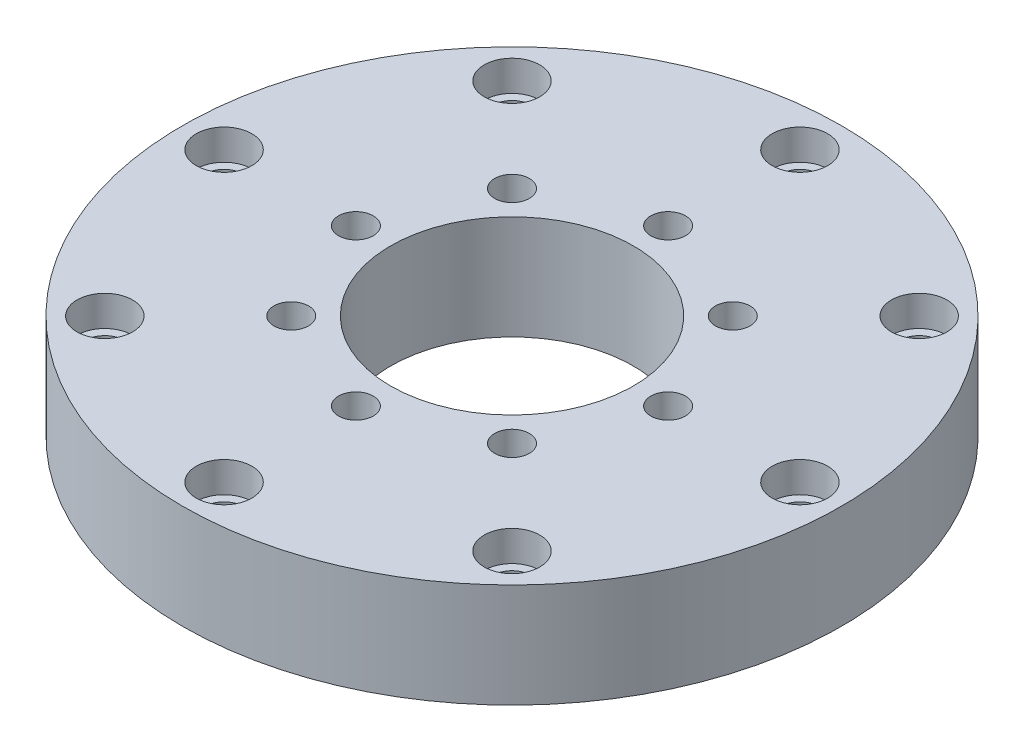
ISO-10303-21;
HEADER;
FILE_DESCRIPTION(('STEP AP214'),'2;1');
FILE_NAME('part.step','',(''),(''),'','','');
FILE_SCHEMA(('AUTOMOTIVE_DESIGN { 1 0 10303 214 1 1 1 1 }'));
ENDSEC;
DATA;
#1=APPLICATION_CONTEXT('core data for automotive mechanical design processes');
#2=APPLICATION_PROTOCOL_DEFINITION('international standard','automotive_design',2000,#1);
#3=PRODUCT_CONTEXT('',#1,'mechanical');
#4=PRODUCT('Part','Part','',(#3));
#5=PRODUCT_RELATED_PRODUCT_CATEGORY('part','',(#4));
#6=PRODUCT_DEFINITION_FORMATION('','',#4);
#7=PRODUCT_DEFINITION_CONTEXT('part definition',#1,'design');
#8=PRODUCT_DEFINITION('design','',#6,#7);
#9=PRODUCT_DEFINITION_SHAPE('','',#8);
#10=(LENGTH_UNIT() NAMED_UNIT(*) SI_UNIT(.MILLI.,.METRE.));
#11=(NAMED_UNIT(*) PLANE_ANGLE_UNIT() SI_UNIT($,.RADIAN.));
#12=(NAMED_UNIT(*) SI_UNIT($,.STERADIAN.) SOLID_ANGLE_UNIT());
#13=UNCERTAINTY_MEASURE_WITH_UNIT(LENGTH_MEASURE(1.E-05),#10,'distance_accuracy_value','');
#14=(GEOMETRIC_REPRESENTATION_CONTEXT(3) GLOBAL_UNCERTAINTY_ASSIGNED_CONTEXT((#13)) GLOBAL_UNIT_ASSIGNED_CONTEXT((#10,
#11,#12)) REPRESENTATION_CONTEXT('',''));
#15=CARTESIAN_POINT('',(0.,0.,0.));
#16=DIRECTION('',(0.,0.,1.));
#17=DIRECTION('',(1.,0.,0.));
#18=AXIS2_PLACEMENT_3D('',#15,#16,#17);
#19=CARTESIAN_POINT('',(0.,15.,0.));
#20=DIRECTION('',(0.,1.,0.));
#21=DIRECTION('',(0.,0.,1.));
#22=AXIS2_PLACEMENT_3D('',#19,#20,#21);
#23=PLANE('',#22);
#24=CARTESIAN_POINT('',(0.,15.,-41.5));
#25=DIRECTION('',(0.,1.,0.));
#26=DIRECTION('',(0.,0.,1.));
#27=AXIS2_PLACEMENT_3D('',#24,#25,#26);
#28=CIRCLE('',#27,4.);
#29=CARTESIAN_POINT('',(0.,15.,-37.5));
#30=VERTEX_POINT('',#29);
#31=EDGE_CURVE('E274',#30,#30,#28,.T.);
#32=ORIENTED_EDGE('',*,*,#31,.F.);
#33=EDGE_LOOP('',(#32));
#34=FACE_BOUND('',#33,.T.);
#35=CARTESIAN_POINT('',(29.3449314192417,15.,-29.3449314192417));
#36=DIRECTION('',(0.,1.,0.));
#37=DIRECTION('',(0.,0.,1.));
#38=AXIS2_PLACEMENT_3D('',#35,#36,#37);
#39=CIRCLE('',#38,4.);
#40=CARTESIAN_POINT('',(29.3449314192417,15.,-25.3449314192417));
#41=VERTEX_POINT('',#40);
#42=EDGE_CURVE('E105',#41,#41,#39,.T.);
#43=ORIENTED_EDGE('',*,*,#42,.F.);
#44=EDGE_LOOP('',(#43));
#45=FACE_BOUND('',#44,.T.);
#46=CARTESIAN_POINT('',(41.5,15.,0.));
#47=DIRECTION('',(0.,1.,0.));
#48=DIRECTION('',(0.,0.,1.));
#49=AXIS2_PLACEMENT_3D('',#46,#47,#48);
#50=CIRCLE('',#49,4.);
#51=CARTESIAN_POINT('',(41.5,15.,4.));
#52=VERTEX_POINT('',#51);
#53=EDGE_CURVE('E96',#52,#52,#50,.T.);
#54=ORIENTED_EDGE('',*,*,#53,.F.);
#55=EDGE_LOOP('',(#54));
#56=FACE_BOUND('',#55,.T.);
#57=CARTESIAN_POINT('',(29.3449314192417,15.,29.3449314192417));
#58=DIRECTION('',(0.,1.,0.));
#59=DIRECTION('',(0.,0.,1.));
#60=AXIS2_PLACEMENT_3D('',#57,#58,#59);
#61=CIRCLE('',#60,4.);
#62=CARTESIAN_POINT('',(29.3449314192417,15.,33.3449314192417));
#63=VERTEX_POINT('',#62);
#64=EDGE_CURVE('E91',#63,#63,#61,.T.);
#65=ORIENTED_EDGE('',*,*,#64,.F.);
#66=EDGE_LOOP('',(#65));
#67=FACE_BOUND('',#66,.T.);
#68=CARTESIAN_POINT('',(0.,15.,41.5));
#69=DIRECTION('',(0.,1.,0.));
#70=DIRECTION('',(0.,0.,1.));
#71=AXIS2_PLACEMENT_3D('',#68,#69,#70);
#72=CIRCLE('',#71,4.);
#73=CARTESIAN_POINT('',(0.,15.,45.5));
#74=VERTEX_POINT('',#73);
#75=EDGE_CURVE('E86',#74,#74,#72,.T.);
#76=ORIENTED_EDGE('',*,*,#75,.F.);
#77=EDGE_LOOP('',(#76));
#78=FACE_BOUND('',#77,.T.);
#79=CARTESIAN_POINT('',(-29.3449314192417,15.,29.3449314192417));
#80=DIRECTION('',(0.,1.,0.));
#81=DIRECTION('',(0.,0.,1.));
#82=AXIS2_PLACEMENT_3D('',#79,#80,#81);
#83=CIRCLE('',#82,4.);
#84=CARTESIAN_POINT('',(-29.3449314192417,15.,33.3449314192417));
#85=VERTEX_POINT('',#84);
#86=EDGE_CURVE('E80',#85,#85,#83,.T.);
#87=ORIENTED_EDGE('',*,*,#86,.F.);
#88=EDGE_LOOP('',(#87));
#89=FACE_BOUND('',#88,.T.);
#90=CARTESIAN_POINT('',(-41.5,15.,0.));
#91=DIRECTION('',(0.,1.,0.));
#92=DIRECTION('',(0.,0.,1.));
#93=AXIS2_PLACEMENT_3D('',#90,#91,#92);
#94=CIRCLE('',#93,4.);
#95=CARTESIAN_POINT('',(-41.5,15.,4.00000000000001));
#96=VERTEX_POINT('',#95);
#97=EDGE_CURVE('E74',#96,#96,#94,.T.);
#98=ORIENTED_EDGE('',*,*,#97,.F.);
#99=EDGE_LOOP('',(#98));
#100=FACE_BOUND('',#99,.T.);
#101=CARTESIAN_POINT('',(-29.3449314192417,15.,-29.3449314192417));
#102=DIRECTION('',(0.,1.,0.));
#103=DIRECTION('',(0.,0.,1.));
#104=AXIS2_PLACEMENT_3D('',#101,#102,#103);
#105=CIRCLE('',#104,4.);
#106=CARTESIAN_POINT('',(-29.3449314192417,15.,-25.3449314192417));
#107=VERTEX_POINT('',#106);
#108=EDGE_CURVE('E68',#107,#107,#105,.T.);
#109=ORIENTED_EDGE('',*,*,#108,.F.);
#110=EDGE_LOOP('',(#109));
#111=FACE_BOUND('',#110,.T.);
#112=CARTESIAN_POINT('',(-22.5,15.,0.));
#113=DIRECTION('',(0.,1.,0.));
#114=DIRECTION('',(0.,0.,1.));
#115=AXIS2_PLACEMENT_3D('',#112,#113,#114);
#116=CIRCLE('',#115,2.5);
#117=CARTESIAN_POINT('',(-22.5,15.,2.50000000000001));
#118=VERTEX_POINT('',#117);
#119=EDGE_CURVE('E155',#118,#118,#116,.T.);
#120=ORIENTED_EDGE('',*,*,#119,.F.);
#121=EDGE_LOOP('',(#120));
#122=FACE_BOUND('',#121,.T.);
#123=CARTESIAN_POINT('',(0.,15.,22.5));
#124=DIRECTION('',(0.,1.,0.));
#125=DIRECTION('',(0.,0.,1.));
#126=AXIS2_PLACEMENT_3D('',#123,#124,#125);
#127=CIRCLE('',#126,2.5);
#128=CARTESIAN_POINT('',(0.,15.,25.));
#129=VERTEX_POINT('',#128);
#130=EDGE_CURVE('E171',#129,#129,#127,.T.);
#131=ORIENTED_EDGE('',*,*,#130,.F.);
#132=EDGE_LOOP('',(#131));
#133=FACE_BOUND('',#132,.T.);
#134=CARTESIAN_POINT('',(22.5,15.,0.));
#135=DIRECTION('',(0.,1.,0.));
#136=DIRECTION('',(0.,0.,1.));
#137=AXIS2_PLACEMENT_3D('',#134,#135,#136);
#138=CIRCLE('',#137,2.5);
#139=CARTESIAN_POINT('',(22.5,15.,2.5));
#140=VERTEX_POINT('',#139);
#141=EDGE_CURVE('E187',#140,#140,#138,.T.);
#142=ORIENTED_EDGE('',*,*,#141,.F.);
#143=EDGE_LOOP('',(#142));
#144=FACE_BOUND('',#143,.T.);
#145=CARTESIAN_POINT('',(0.,15.,0.));
#146=DIRECTION('',(0.,1.,0.));
#147=DIRECTION('',(0.,0.,1.));
#148=AXIS2_PLACEMENT_3D('',#145,#146,#147);
#149=CIRCLE('',#148,47.5);
#150=CARTESIAN_POINT('',(0.,15.,47.5));
#151=VERTEX_POINT('',#150);
#152=EDGE_CURVE('E10',#151,#151,#149,.T.);
#153=ORIENTED_EDGE('',*,*,#152,.T.);
#154=EDGE_LOOP('',(#153));
#155=FACE_BOUND('',#154,.T.);
#156=CARTESIAN_POINT('',(0.,15.,0.));
#157=DIRECTION('',(0.,1.,0.));
#158=DIRECTION('',(0.,0.,1.));
#159=AXIS2_PLACEMENT_3D('',#156,#157,#158);
#160=CIRCLE('',#159,17.5);
#161=CARTESIAN_POINT('',(0.,15.,17.5));
#162=VERTEX_POINT('',#161);
#163=EDGE_CURVE('E52',#162,#162,#160,.T.);
#164=ORIENTED_EDGE('',*,*,#163,.F.);
#165=EDGE_LOOP('',(#164));
#166=FACE_BOUND('',#165,.T.);
#167=CARTESIAN_POINT('',(0.,15.,-22.5));
#168=DIRECTION('',(0.,1.,0.));
#169=DIRECTION('',(0.,0.,1.));
#170=AXIS2_PLACEMENT_3D('',#167,#168,#169);
#171=CIRCLE('',#170,2.5);
#172=CARTESIAN_POINT('',(0.,15.,-20.));
#173=VERTEX_POINT('',#172);
#174=EDGE_CURVE('E231',#173,#173,#171,.T.);
#175=ORIENTED_EDGE('',*,*,#174,.F.);
#176=EDGE_LOOP('',(#175));
#177=FACE_BOUND('',#176,.T.);
#178=CARTESIAN_POINT('',(15.9099025766973,15.,-15.9099025766973));
#179=DIRECTION('',(0.,1.,0.));
#180=DIRECTION('',(0.,0.,1.));
#181=AXIS2_PLACEMENT_3D('',#178,#179,#180);
#182=CIRCLE('',#181,2.5);
#183=CARTESIAN_POINT('',(15.9099025766973,15.,-13.4099025766973));
#184=VERTEX_POINT('',#183);
#185=EDGE_CURVE('E195',#184,#184,#182,.T.);
#186=ORIENTED_EDGE('',*,*,#185,.F.);
#187=EDGE_LOOP('',(#186));
#188=FACE_BOUND('',#187,.T.);
#189=CARTESIAN_POINT('',(15.9099025766973,15.,15.9099025766973));
#190=DIRECTION('',(0.,1.,0.));
#191=DIRECTION('',(0.,0.,1.));
#192=AXIS2_PLACEMENT_3D('',#189,#190,#191);
#193=CIRCLE('',#192,2.50000000000001);
#194=CARTESIAN_POINT('',(15.9099025766973,15.,18.4099025766973));
#195=VERTEX_POINT('',#194);
#196=EDGE_CURVE('E179',#195,#195,#193,.T.);
#197=ORIENTED_EDGE('',*,*,#196,.F.);
#198=EDGE_LOOP('',(#197));
#199=FACE_BOUND('',#198,.T.);
#200=CARTESIAN_POINT('',(-15.9099025766973,15.,15.9099025766973));
#201=DIRECTION('',(0.,1.,0.));
#202=DIRECTION('',(0.,0.,1.));
#203=AXIS2_PLACEMENT_3D('',#200,#201,#202);
#204=CIRCLE('',#203,2.5);
#205=CARTESIAN_POINT('',(-15.9099025766973,15.,18.4099025766973));
#206=VERTEX_POINT('',#205);
#207=EDGE_CURVE('E163',#206,#206,#204,.T.);
#208=ORIENTED_EDGE('',*,*,#207,.F.);
#209=EDGE_LOOP('',(#208));
#210=FACE_BOUND('',#209,.T.);
#211=CARTESIAN_POINT('',(-15.9099025766973,15.,-15.9099025766973));
#212=DIRECTION('',(0.,1.,0.));
#213=DIRECTION('',(0.,0.,1.));
#214=AXIS2_PLACEMENT_3D('',#211,#212,#213);
#215=CIRCLE('',#214,2.5);
#216=CARTESIAN_POINT('',(-15.9099025766973,15.,-13.4099025766973));
#217=VERTEX_POINT('',#216);
#218=EDGE_CURVE('E147',#217,#217,#215,.T.);
#219=ORIENTED_EDGE('',*,*,#218,.F.);
#220=EDGE_LOOP('',(#219));
#221=FACE_BOUND('',#220,.T.);
#222=ADVANCED_FACE('F37',(#34,#45,#56,#67,#78,#89,#100,#111,#122,#133,#144,#155,#166,#177,#188,
#199,#210,#221),#23,.T.);
#223=CARTESIAN_POINT('',(0.,0.,0.));
#224=DIRECTION('',(0.,1.,0.));
#225=DIRECTION('',(0.,0.,1.));
#226=AXIS2_PLACEMENT_3D('',#223,#224,#225);
#227=PLANE('',#226);
#228=CARTESIAN_POINT('',(0.,0.,0.));
#229=DIRECTION('',(0.,1.,0.));
#230=DIRECTION('',(0.,0.,1.));
#231=AXIS2_PLACEMENT_3D('',#228,#229,#230);
#232=CIRCLE('',#231,47.5);
#233=CARTESIAN_POINT('',(0.,0.,47.5));
#234=VERTEX_POINT('',#233);
#235=EDGE_CURVE('E46',#234,#234,#232,.T.);
#236=ORIENTED_EDGE('',*,*,#235,.F.);
#237=EDGE_LOOP('',(#236));
#238=FACE_BOUND('',#237,.T.);
#239=CARTESIAN_POINT('',(0.,0.,0.));
#240=DIRECTION('',(0.,1.,0.));
#241=DIRECTION('',(0.,0.,1.));
#242=AXIS2_PLACEMENT_3D('',#239,#240,#241);
#243=CIRCLE('',#242,17.5);
#244=CARTESIAN_POINT('',(0.,0.,17.5));
#245=VERTEX_POINT('',#244);
#246=EDGE_CURVE('E55',#245,#245,#243,.T.);
#247=ORIENTED_EDGE('',*,*,#246,.T.);
#248=EDGE_LOOP('',(#247));
#249=FACE_BOUND('',#248,.T.);
#250=CARTESIAN_POINT('',(0.,0.,-41.5));
#251=DIRECTION('',(0.,1.,0.));
#252=DIRECTION('',(0.,0.,1.));
#253=AXIS2_PLACEMENT_3D('',#250,#251,#252);
#254=CIRCLE('',#253,2.75);
#255=CARTESIAN_POINT('',(0.,0.,-38.75));
#256=VERTEX_POINT('',#255);
#257=EDGE_CURVE('E235',#256,#256,#254,.T.);
#258=ORIENTED_EDGE('',*,*,#257,.T.);
#259=EDGE_LOOP('',(#258));
#260=FACE_BOUND('',#259,.T.);
#261=CARTESIAN_POINT('',(0.,0.,-22.5));
#262=DIRECTION('',(0.,1.,0.));
#263=DIRECTION('',(0.,0.,1.));
#264=AXIS2_PLACEMENT_3D('',#261,#262,#263);
#265=CIRCLE('',#264,2.5);
#266=CARTESIAN_POINT('',(0.,0.,-20.));
#267=VERTEX_POINT('',#266);
#268=EDGE_CURVE('E230',#267,#267,#265,.T.);
#269=ORIENTED_EDGE('',*,*,#268,.T.);
#270=EDGE_LOOP('',(#269));
#271=FACE_BOUND('',#270,.T.);
#272=CARTESIAN_POINT('',(29.3449314192417,0.,-29.3449314192417));
#273=DIRECTION('',(0.,1.,0.));
#274=DIRECTION('',(0.,0.,1.));
#275=AXIS2_PLACEMENT_3D('',#272,#273,#274);
#276=CIRCLE('',#275,2.74999999999999);
#277=CARTESIAN_POINT('',(29.3449314192417,0.,-26.5949314192417));
#278=VERTEX_POINT('',#277);
#279=EDGE_CURVE('E226',#278,#278,#276,.T.);
#280=ORIENTED_EDGE('',*,*,#279,.T.);
#281=EDGE_LOOP('',(#280));
#282=FACE_BOUND('',#281,.T.);
#283=CARTESIAN_POINT('',(41.5,0.,0.));
#284=DIRECTION('',(0.,1.,0.));
#285=DIRECTION('',(0.,0.,1.));
#286=AXIS2_PLACEMENT_3D('',#283,#284,#285);
#287=CIRCLE('',#286,2.75);
#288=CARTESIAN_POINT('',(41.5,0.,2.75));
#289=VERTEX_POINT('',#288);
#290=EDGE_CURVE('E222',#289,#289,#287,.T.);
#291=ORIENTED_EDGE('',*,*,#290,.T.);
#292=EDGE_LOOP('',(#291));
#293=FACE_BOUND('',#292,.T.);
#294=CARTESIAN_POINT('',(29.3449314192417,0.,29.3449314192417));
#295=DIRECTION('',(0.,1.,0.));
#296=DIRECTION('',(0.,0.,1.));
#297=AXIS2_PLACEMENT_3D('',#294,#295,#296);
#298=CIRCLE('',#297,2.74999999999999);
#299=CARTESIAN_POINT('',(29.3449314192417,0.,32.0949314192417));
#300=VERTEX_POINT('',#299);
#301=EDGE_CURVE('E218',#300,#300,#298,.T.);
#302=ORIENTED_EDGE('',*,*,#301,.T.);
#303=EDGE_LOOP('',(#302));
#304=FACE_BOUND('',#303,.T.);
#305=CARTESIAN_POINT('',(0.,0.,41.5));
#306=DIRECTION('',(0.,1.,0.));
#307=DIRECTION('',(0.,0.,1.));
#308=AXIS2_PLACEMENT_3D('',#305,#306,#307);
#309=CIRCLE('',#308,2.75);
#310=CARTESIAN_POINT('',(0.,0.,44.25));
#311=VERTEX_POINT('',#310);
#312=EDGE_CURVE('E214',#311,#311,#309,.T.);
#313=ORIENTED_EDGE('',*,*,#312,.T.);
#314=EDGE_LOOP('',(#313));
#315=FACE_BOUND('',#314,.T.);
#316=CARTESIAN_POINT('',(-29.3449314192417,0.,29.3449314192417));
#317=DIRECTION('',(0.,1.,0.));
#318=DIRECTION('',(0.,0.,1.));
#319=AXIS2_PLACEMENT_3D('',#316,#317,#318);
#320=CIRCLE('',#319,2.75000000000001);
#321=CARTESIAN_POINT('',(-29.3449314192417,0.,32.0949314192417));
#322=VERTEX_POINT('',#321);
#323=EDGE_CURVE('E210',#322,#322,#320,.T.);
#324=ORIENTED_EDGE('',*,*,#323,.T.);
#325=EDGE_LOOP('',(#324));
#326=FACE_BOUND('',#325,.T.);
#327=CARTESIAN_POINT('',(-41.5,0.,0.));
#328=DIRECTION('',(0.,1.,0.));
#329=DIRECTION('',(0.,0.,1.));
#330=AXIS2_PLACEMENT_3D('',#327,#328,#329);
#331=CIRCLE('',#330,2.75000000000001);
#332=CARTESIAN_POINT('',(-41.5,0.,2.75000000000002));
#333=VERTEX_POINT('',#332);
#334=EDGE_CURVE('E206',#333,#333,#331,.T.);
#335=ORIENTED_EDGE('',*,*,#334,.T.);
#336=EDGE_LOOP('',(#335));
#337=FACE_BOUND('',#336,.T.);
#338=CARTESIAN_POINT('',(-29.3449314192417,0.,-29.3449314192417));
#339=DIRECTION('',(0.,1.,0.));
#340=DIRECTION('',(0.,0.,1.));
#341=AXIS2_PLACEMENT_3D('',#338,#339,#340);
#342=CIRCLE('',#341,2.75000000000001);
#343=CARTESIAN_POINT('',(-29.3449314192417,0.,-26.5949314192417));
#344=VERTEX_POINT('',#343);
#345=EDGE_CURVE('E199',#344,#344,#342,.T.);
#346=ORIENTED_EDGE('',*,*,#345,.T.);
#347=EDGE_LOOP('',(#346));
#348=FACE_BOUND('',#347,.T.);
#349=CARTESIAN_POINT('',(15.9099025766973,0.,-15.9099025766973));
#350=DIRECTION('',(0.,1.,0.));
#351=DIRECTION('',(0.,0.,1.));
#352=AXIS2_PLACEMENT_3D('',#349,#350,#351);
#353=CIRCLE('',#352,2.5);
#354=CARTESIAN_POINT('',(15.9099025766973,0.,-13.4099025766973));
#355=VERTEX_POINT('',#354);
#356=EDGE_CURVE('E191',#355,#355,#353,.T.);
#357=ORIENTED_EDGE('',*,*,#356,.T.);
#358=EDGE_LOOP('',(#357));
#359=FACE_BOUND('',#358,.T.);
#360=CARTESIAN_POINT('',(22.5,0.,0.));
#361=DIRECTION('',(0.,1.,0.));
#362=DIRECTION('',(0.,0.,1.));
#363=AXIS2_PLACEMENT_3D('',#360,#361,#362);
#364=CIRCLE('',#363,2.5);
#365=CARTESIAN_POINT('',(22.5,0.,2.5));
#366=VERTEX_POINT('',#365);
#367=EDGE_CURVE('E183',#366,#366,#364,.T.);
#368=ORIENTED_EDGE('',*,*,#367,.T.);
#369=EDGE_LOOP('',(#368));
#370=FACE_BOUND('',#369,.T.);
#371=CARTESIAN_POINT('',(15.9099025766973,0.,15.9099025766973));
#372=DIRECTION('',(0.,1.,0.));
#373=DIRECTION('',(0.,0.,1.));
#374=AXIS2_PLACEMENT_3D('',#371,#372,#373);
#375=CIRCLE('',#374,2.50000000000001);
#376=CARTESIAN_POINT('',(15.9099025766973,0.,18.4099025766973));
#377=VERTEX_POINT('',#376);
#378=EDGE_CURVE('E175',#377,#377,#375,.T.);
#379=ORIENTED_EDGE('',*,*,#378,.T.);
#380=EDGE_LOOP('',(#379));
#381=FACE_BOUND('',#380,.T.);
#382=CARTESIAN_POINT('',(0.,0.,22.5));
#383=DIRECTION('',(0.,1.,0.));
#384=DIRECTION('',(0.,0.,1.));
#385=AXIS2_PLACEMENT_3D('',#382,#383,#384);
#386=CIRCLE('',#385,2.5);
#387=CARTESIAN_POINT('',(0.,0.,25.));
#388=VERTEX_POINT('',#387);
#389=EDGE_CURVE('E167',#388,#388,#386,.T.);
#390=ORIENTED_EDGE('',*,*,#389,.T.);
#391=EDGE_LOOP('',(#390));
#392=FACE_BOUND('',#391,.T.);
#393=CARTESIAN_POINT('',(-15.9099025766973,0.,15.9099025766973));
#394=DIRECTION('',(0.,1.,0.));
#395=DIRECTION('',(0.,0.,1.));
#396=AXIS2_PLACEMENT_3D('',#393,#394,#395);
#397=CIRCLE('',#396,2.5);
#398=CARTESIAN_POINT('',(-15.9099025766973,0.,18.4099025766973));
#399=VERTEX_POINT('',#398);
#400=EDGE_CURVE('E159',#399,#399,#397,.T.);
#401=ORIENTED_EDGE('',*,*,#400,.T.);
#402=EDGE_LOOP('',(#401));
#403=FACE_BOUND('',#402,.T.);
#404=CARTESIAN_POINT('',(-22.5,0.,0.));
#405=DIRECTION('',(0.,1.,0.));
#406=DIRECTION('',(0.,0.,1.));
#407=AXIS2_PLACEMENT_3D('',#404,#405,#406);
#408=CIRCLE('',#407,2.5);
#409=CARTESIAN_POINT('',(-22.5,0.,2.50000000000001));
#410=VERTEX_POINT('',#409);
#411=EDGE_CURVE('E151',#410,#410,#408,.T.);
#412=ORIENTED_EDGE('',*,*,#411,.T.);
#413=EDGE_LOOP('',(#412));
#414=FACE_BOUND('',#413,.T.);
#415=CARTESIAN_POINT('',(-15.9099025766973,0.,-15.9099025766973));
#416=DIRECTION('',(0.,1.,0.));
#417=DIRECTION('',(0.,0.,1.));
#418=AXIS2_PLACEMENT_3D('',#415,#416,#417);
#419=CIRCLE('',#418,2.5);
#420=CARTESIAN_POINT('',(-15.9099025766973,0.,-13.4099025766973));
#421=VERTEX_POINT('',#420);
#422=EDGE_CURVE('E62',#421,#421,#419,.T.);
#423=ORIENTED_EDGE('',*,*,#422,.T.);
#424=EDGE_LOOP('',(#423));
#425=FACE_BOUND('',#424,.T.);
#426=ADVANCED_FACE('F249',(#238,#249,#260,#271,#282,#293,#304,#315,#326,#337,#348,#359,#370,
#381,#392,#403,#414,#425),#227,.F.);
#427=CARTESIAN_POINT('',(0.,15.,0.));
#428=DIRECTION('',(0.,-1.,0.));
#429=DIRECTION('',(0.,0.,-1.));
#430=AXIS2_PLACEMENT_3D('',#427,#428,#429);
#431=CYLINDRICAL_SURFACE('',#430,47.5);
#432=ORIENTED_EDGE('',*,*,#152,.F.);
#433=EDGE_LOOP('',(#432));
#434=FACE_BOUND('',#433,.T.);
#435=ORIENTED_EDGE('',*,*,#235,.T.);
#436=EDGE_LOOP('',(#435));
#437=FACE_BOUND('',#436,.T.);
#438=ADVANCED_FACE('F39',(#434,#437),#431,.T.);
#439=CARTESIAN_POINT('',(0.,15.,0.));
#440=DIRECTION('',(0.,-1.,0.));
#441=DIRECTION('',(0.,0.,-1.));
#442=AXIS2_PLACEMENT_3D('',#439,#440,#441);
#443=CYLINDRICAL_SURFACE('',#442,17.5);
#444=ORIENTED_EDGE('',*,*,#163,.T.);
#445=EDGE_LOOP('',(#444));
#446=FACE_BOUND('',#445,.T.);
#447=ORIENTED_EDGE('',*,*,#246,.F.);
#448=EDGE_LOOP('',(#447));
#449=FACE_BOUND('',#448,.T.);
#450=ADVANCED_FACE('F252',(#446,#449),#443,.F.);
#451=CARTESIAN_POINT('',(0.,15.,-41.5));
#452=DIRECTION('',(0.,-1.,0.));
#453=DIRECTION('',(0.,0.,-1.));
#454=AXIS2_PLACEMENT_3D('',#451,#452,#453);
#455=CYLINDRICAL_SURFACE('',#454,2.75);
#456=CARTESIAN_POINT('',(0.,10.6,-41.5));
#457=DIRECTION('',(0.,-1.,0.));
#458=DIRECTION('',(0.,0.,-1.));
#459=AXIS2_PLACEMENT_3D('',#456,#457,#458);
#460=CIRCLE('',#459,2.75);
#461=CARTESIAN_POINT('',(0.,10.6,-44.25));
#462=VERTEX_POINT('',#461);
#463=EDGE_CURVE('E41',#462,#462,#460,.T.);
#464=ORIENTED_EDGE('',*,*,#463,.F.);
#465=EDGE_LOOP('',(#464));
#466=FACE_BOUND('',#465,.T.);
#467=ORIENTED_EDGE('',*,*,#257,.F.);
#468=EDGE_LOOP('',(#467));
#469=FACE_BOUND('',#468,.T.);
#470=ADVANCED_FACE('F254',(#466,#469),#455,.F.);
#471=CARTESIAN_POINT('',(0.,15.,-22.5));
#472=DIRECTION('',(0.,-1.,0.));
#473=DIRECTION('',(0.,0.,-1.));
#474=AXIS2_PLACEMENT_3D('',#471,#472,#473);
#475=CYLINDRICAL_SURFACE('',#474,2.5);
#476=ORIENTED_EDGE('',*,*,#174,.T.);
#477=EDGE_LOOP('',(#476));
#478=FACE_BOUND('',#477,.T.);
#479=ORIENTED_EDGE('',*,*,#268,.F.);
#480=EDGE_LOOP('',(#479));
#481=FACE_BOUND('',#480,.T.);
#482=ADVANCED_FACE('F260',(#478,#481),#475,.F.);
#483=CARTESIAN_POINT('',(29.3449314192417,15.,-29.3449314192417));
#484=DIRECTION('',(0.,-1.,0.));
#485=DIRECTION('',(0.,0.,-1.));
#486=AXIS2_PLACEMENT_3D('',#483,#484,#485);
#487=CYLINDRICAL_SURFACE('',#486,2.74999999999999);
#488=CARTESIAN_POINT('',(29.3449314192417,10.6,-29.3449314192417));
#489=DIRECTION('',(0.,-1.,0.));
#490=DIRECTION('',(0.,0.,-1.));
#491=AXIS2_PLACEMENT_3D('',#488,#489,#490);
#492=CIRCLE('',#491,2.74999999999999);
#493=CARTESIAN_POINT('',(29.3449314192417,10.6,-32.0949314192417));
#494=VERTEX_POINT('',#493);
#495=EDGE_CURVE('E93',#494,#494,#492,.T.);
#496=ORIENTED_EDGE('',*,*,#495,.F.);
#497=EDGE_LOOP('',(#496));
#498=FACE_BOUND('',#497,.T.);
#499=ORIENTED_EDGE('',*,*,#279,.F.);
#500=EDGE_LOOP('',(#499));
#501=FACE_BOUND('',#500,.T.);
#502=ADVANCED_FACE('F368',(#498,#501),#487,.F.);
#503=CARTESIAN_POINT('',(41.5,15.,0.));
#504=DIRECTION('',(0.,-1.,0.));
#505=DIRECTION('',(0.,0.,-1.));
#506=AXIS2_PLACEMENT_3D('',#503,#504,#505);
#507=CYLINDRICAL_SURFACE('',#506,2.75);
#508=CARTESIAN_POINT('',(41.5,10.6,0.));
#509=DIRECTION('',(0.,-1.,0.));
#510=DIRECTION('',(0.,0.,-1.));
#511=AXIS2_PLACEMENT_3D('',#508,#509,#510);
#512=CIRCLE('',#511,2.75);
#513=CARTESIAN_POINT('',(41.5,10.6,-2.75));
#514=VERTEX_POINT('',#513);
#515=EDGE_CURVE('E88',#514,#514,#512,.T.);
#516=ORIENTED_EDGE('',*,*,#515,.F.);
#517=EDGE_LOOP('',(#516));
#518=FACE_BOUND('',#517,.T.);
#519=ORIENTED_EDGE('',*,*,#290,.F.);
#520=EDGE_LOOP('',(#519));
#521=FACE_BOUND('',#520,.T.);
#522=ADVANCED_FACE('F364',(#518,#521),#507,.F.);
#523=CARTESIAN_POINT('',(29.3449314192417,15.,29.3449314192417));
#524=DIRECTION('',(0.,-1.,0.));
#525=DIRECTION('',(0.,0.,-1.));
#526=AXIS2_PLACEMENT_3D('',#523,#524,#525);
#527=CYLINDRICAL_SURFACE('',#526,2.74999999999999);
#528=CARTESIAN_POINT('',(29.3449314192417,10.6,29.3449314192417));
#529=DIRECTION('',(0.,-1.,0.));
#530=DIRECTION('',(0.,0.,-1.));
#531=AXIS2_PLACEMENT_3D('',#528,#529,#530);
#532=CIRCLE('',#531,2.74999999999999);
#533=CARTESIAN_POINT('',(29.3449314192417,10.6,26.5949314192417));
#534=VERTEX_POINT('',#533);
#535=EDGE_CURVE('E82',#534,#534,#532,.T.);
#536=ORIENTED_EDGE('',*,*,#535,.F.);
#537=EDGE_LOOP('',(#536));
#538=FACE_BOUND('',#537,.T.);
#539=ORIENTED_EDGE('',*,*,#301,.F.);
#540=EDGE_LOOP('',(#539));
#541=FACE_BOUND('',#540,.T.);
#542=ADVANCED_FACE('F360',(#538,#541),#527,.F.);
#543=CARTESIAN_POINT('',(0.,15.,41.5));
#544=DIRECTION('',(0.,-1.,0.));
#545=DIRECTION('',(0.,0.,-1.));
#546=AXIS2_PLACEMENT_3D('',#543,#544,#545);
#547=CYLINDRICAL_SURFACE('',#546,2.75);
#548=CARTESIAN_POINT('',(0.,10.6,41.5));
#549=DIRECTION('',(0.,-1.,0.));
#550=DIRECTION('',(0.,0.,-1.));
#551=AXIS2_PLACEMENT_3D('',#548,#549,#550);
#552=CIRCLE('',#551,2.75);
#553=CARTESIAN_POINT('',(0.,10.6,38.75));
#554=VERTEX_POINT('',#553);
#555=EDGE_CURVE('E76',#554,#554,#552,.T.);
#556=ORIENTED_EDGE('',*,*,#555,.F.);
#557=EDGE_LOOP('',(#556));
#558=FACE_BOUND('',#557,.T.);
#559=ORIENTED_EDGE('',*,*,#312,.F.);
#560=EDGE_LOOP('',(#559));
#561=FACE_BOUND('',#560,.T.);
#562=ADVANCED_FACE('F356',(#558,#561),#547,.F.);
#563=CARTESIAN_POINT('',(-29.3449314192417,15.,29.3449314192417));
#564=DIRECTION('',(0.,-1.,0.));
#565=DIRECTION('',(0.,0.,-1.));
#566=AXIS2_PLACEMENT_3D('',#563,#564,#565);
#567=CYLINDRICAL_SURFACE('',#566,2.75000000000001);
#568=CARTESIAN_POINT('',(-29.3449314192417,10.6,29.3449314192417));
#569=DIRECTION('',(0.,-1.,0.));
#570=DIRECTION('',(0.,0.,-1.));
#571=AXIS2_PLACEMENT_3D('',#568,#569,#570);
#572=CIRCLE('',#571,2.75000000000001);
#573=CARTESIAN_POINT('',(-29.3449314192417,10.6,26.5949314192417));
#574=VERTEX_POINT('',#573);
#575=EDGE_CURVE('E70',#574,#574,#572,.T.);
#576=ORIENTED_EDGE('',*,*,#575,.F.);
#577=EDGE_LOOP('',(#576));
#578=FACE_BOUND('',#577,.T.);
#579=ORIENTED_EDGE('',*,*,#323,.F.);
#580=EDGE_LOOP('',(#579));
#581=FACE_BOUND('',#580,.T.);
#582=ADVANCED_FACE('F352',(#578,#581),#567,.F.);
#583=CARTESIAN_POINT('',(-41.5,15.,0.));
#584=DIRECTION('',(0.,-1.,0.));
#585=DIRECTION('',(0.,0.,-1.));
#586=AXIS2_PLACEMENT_3D('',#583,#584,#585);
#587=CYLINDRICAL_SURFACE('',#586,2.75000000000001);
#588=CARTESIAN_POINT('',(-41.5,10.6,0.));
#589=DIRECTION('',(0.,-1.,0.));
#590=DIRECTION('',(0.,0.,-1.));
#591=AXIS2_PLACEMENT_3D('',#588,#589,#590);
#592=CIRCLE('',#591,2.75000000000001);
#593=CARTESIAN_POINT('',(-41.5,10.6,-2.75));
#594=VERTEX_POINT('',#593);
#595=EDGE_CURVE('E64',#594,#594,#592,.T.);
#596=ORIENTED_EDGE('',*,*,#595,.F.);
#597=EDGE_LOOP('',(#596));
#598=FACE_BOUND('',#597,.T.);
#599=ORIENTED_EDGE('',*,*,#334,.F.);
#600=EDGE_LOOP('',(#599));
#601=FACE_BOUND('',#600,.T.);
#602=ADVANCED_FACE('F348',(#598,#601),#587,.F.);
#603=CARTESIAN_POINT('',(-29.3449314192417,15.,-29.3449314192417));
#604=DIRECTION('',(0.,-1.,0.));
#605=DIRECTION('',(0.,0.,-1.));
#606=AXIS2_PLACEMENT_3D('',#603,#604,#605);
#607=CYLINDRICAL_SURFACE('',#606,2.75000000000001);
#608=CARTESIAN_POINT('',(-29.3449314192417,10.6,-29.3449314192417));
#609=DIRECTION('',(0.,-1.,0.));
#610=DIRECTION('',(0.,0.,-1.));
#611=AXIS2_PLACEMENT_3D('',#608,#609,#610);
#612=CIRCLE('',#611,2.75000000000001);
#613=CARTESIAN_POINT('',(-29.3449314192417,10.6,-32.0949314192417));
#614=VERTEX_POINT('',#613);
#615=EDGE_CURVE('E58',#614,#614,#612,.T.);
#616=ORIENTED_EDGE('',*,*,#615,.F.);
#617=EDGE_LOOP('',(#616));
#618=FACE_BOUND('',#617,.T.);
#619=ORIENTED_EDGE('',*,*,#345,.F.);
#620=EDGE_LOOP('',(#619));
#621=FACE_BOUND('',#620,.T.);
#622=ADVANCED_FACE('F344',(#618,#621),#607,.F.);
#623=CARTESIAN_POINT('',(15.9099025766973,15.,-15.9099025766973));
#624=DIRECTION('',(0.,-1.,0.));
#625=DIRECTION('',(0.,0.,-1.));
#626=AXIS2_PLACEMENT_3D('',#623,#624,#625);
#627=CYLINDRICAL_SURFACE('',#626,2.5);
#628=ORIENTED_EDGE('',*,*,#185,.T.);
#629=EDGE_LOOP('',(#628));
#630=FACE_BOUND('',#629,.T.);
#631=ORIENTED_EDGE('',*,*,#356,.F.);
#632=EDGE_LOOP('',(#631));
#633=FACE_BOUND('',#632,.T.);
#634=ADVANCED_FACE('F340',(#630,#633),#627,.F.);
#635=CARTESIAN_POINT('',(22.5,15.,0.));
#636=DIRECTION('',(0.,-1.,0.));
#637=DIRECTION('',(0.,0.,-1.));
#638=AXIS2_PLACEMENT_3D('',#635,#636,#637);
#639=CYLINDRICAL_SURFACE('',#638,2.5);
#640=ORIENTED_EDGE('',*,*,#141,.T.);
#641=EDGE_LOOP('',(#640));
#642=FACE_BOUND('',#641,.T.);
#643=ORIENTED_EDGE('',*,*,#367,.F.);
#644=EDGE_LOOP('',(#643));
#645=FACE_BOUND('',#644,.T.);
#646=ADVANCED_FACE('F336',(#642,#645),#639,.F.);
#647=CARTESIAN_POINT('',(15.9099025766973,15.,15.9099025766973));
#648=DIRECTION('',(0.,-1.,0.));
#649=DIRECTION('',(0.,0.,-1.));
#650=AXIS2_PLACEMENT_3D('',#647,#648,#649);
#651=CYLINDRICAL_SURFACE('',#650,2.50000000000001);
#652=ORIENTED_EDGE('',*,*,#196,.T.);
#653=EDGE_LOOP('',(#652));
#654=FACE_BOUND('',#653,.T.);
#655=ORIENTED_EDGE('',*,*,#378,.F.);
#656=EDGE_LOOP('',(#655));
#657=FACE_BOUND('',#656,.T.);
#658=ADVANCED_FACE('F332',(#654,#657),#651,.F.);
#659=CARTESIAN_POINT('',(0.,15.,22.5));
#660=DIRECTION('',(0.,-1.,0.));
#661=DIRECTION('',(0.,0.,-1.));
#662=AXIS2_PLACEMENT_3D('',#659,#660,#661);
#663=CYLINDRICAL_SURFACE('',#662,2.5);
#664=ORIENTED_EDGE('',*,*,#130,.T.);
#665=EDGE_LOOP('',(#664));
#666=FACE_BOUND('',#665,.T.);
#667=ORIENTED_EDGE('',*,*,#389,.F.);
#668=EDGE_LOOP('',(#667));
#669=FACE_BOUND('',#668,.T.);
#670=ADVANCED_FACE('F328',(#666,#669),#663,.F.);
#671=CARTESIAN_POINT('',(-15.9099025766973,15.,15.9099025766973));
#672=DIRECTION('',(0.,-1.,0.));
#673=DIRECTION('',(0.,0.,-1.));
#674=AXIS2_PLACEMENT_3D('',#671,#672,#673);
#675=CYLINDRICAL_SURFACE('',#674,2.5);
#676=ORIENTED_EDGE('',*,*,#207,.T.);
#677=EDGE_LOOP('',(#676));
#678=FACE_BOUND('',#677,.T.);
#679=ORIENTED_EDGE('',*,*,#400,.F.);
#680=EDGE_LOOP('',(#679));
#681=FACE_BOUND('',#680,.T.);
#682=ADVANCED_FACE('F321',(#678,#681),#675,.F.);
#683=CARTESIAN_POINT('',(-22.5,15.,0.));
#684=DIRECTION('',(0.,-1.,0.));
#685=DIRECTION('',(0.,0.,-1.));
#686=AXIS2_PLACEMENT_3D('',#683,#684,#685);
#687=CYLINDRICAL_SURFACE('',#686,2.5);
#688=ORIENTED_EDGE('',*,*,#119,.T.);
#689=EDGE_LOOP('',(#688));
#690=FACE_BOUND('',#689,.T.);
#691=ORIENTED_EDGE('',*,*,#411,.F.);
#692=EDGE_LOOP('',(#691));
#693=FACE_BOUND('',#692,.T.);
#694=ADVANCED_FACE('F310',(#690,#693),#687,.F.);
#695=CARTESIAN_POINT('',(-15.9099025766973,15.,-15.9099025766973));
#696=DIRECTION('',(0.,-1.,0.));
#697=DIRECTION('',(0.,0.,-1.));
#698=AXIS2_PLACEMENT_3D('',#695,#696,#697);
#699=CYLINDRICAL_SURFACE('',#698,2.5);
#700=ORIENTED_EDGE('',*,*,#218,.T.);
#701=EDGE_LOOP('',(#700));
#702=FACE_BOUND('',#701,.T.);
#703=ORIENTED_EDGE('',*,*,#422,.F.);
#704=EDGE_LOOP('',(#703));
#705=FACE_BOUND('',#704,.T.);
#706=ADVANCED_FACE('F306',(#702,#705),#699,.F.);
#707=CARTESIAN_POINT('',(-27.0949314192417,10.6,-29.3449314192417));
#708=DIRECTION('',(0.,-1.,0.));
#709=DIRECTION('',(0.,0.,-1.));
#710=AXIS2_PLACEMENT_3D('',#707,#708,#709);
#711=PLANE('',#710);
#712=ORIENTED_EDGE('',*,*,#615,.T.);
#713=EDGE_LOOP('',(#712));
#714=FACE_BOUND('',#713,.T.);
#715=CARTESIAN_POINT('',(-29.3449314192417,10.6,-29.3449314192417));
#716=DIRECTION('',(0.,1.,0.));
#717=DIRECTION('',(0.,0.,1.));
#718=AXIS2_PLACEMENT_3D('',#715,#716,#717);
#719=CIRCLE('',#718,4.);
#720=CARTESIAN_POINT('',(-29.3449314192417,10.6,-25.3449314192417));
#721=VERTEX_POINT('',#720);
#722=EDGE_CURVE('E63',#721,#721,#719,.T.);
#723=ORIENTED_EDGE('',*,*,#722,.T.);
#724=EDGE_LOOP('',(#723));
#725=FACE_BOUND('',#724,.T.);
#726=ADVANCED_FACE('F309',(#714,#725),#711,.F.);
#727=CARTESIAN_POINT('',(-29.3449314192417,15.,-29.3449314192417));
#728=DIRECTION('',(0.,1.,0.));
#729=DIRECTION('',(0.,0.,1.));
#730=AXIS2_PLACEMENT_3D('',#727,#728,#729);
#731=CYLINDRICAL_SURFACE('',#730,4.);
#732=ORIENTED_EDGE('',*,*,#722,.F.);
#733=EDGE_LOOP('',(#732));
#734=FACE_BOUND('',#733,.T.);
#735=ORIENTED_EDGE('',*,*,#108,.T.);
#736=EDGE_LOOP('',(#735));
#737=FACE_BOUND('',#736,.T.);
#738=ADVANCED_FACE('F318',(#734,#737),#731,.F.);
#739=CARTESIAN_POINT('',(-39.25,10.6,0.));
#740=DIRECTION('',(0.,-1.,0.));
#741=DIRECTION('',(0.,0.,-1.));
#742=AXIS2_PLACEMENT_3D('',#739,#740,#741);
#743=PLANE('',#742);
#744=ORIENTED_EDGE('',*,*,#595,.T.);
#745=EDGE_LOOP('',(#744));
#746=FACE_BOUND('',#745,.T.);
#747=CARTESIAN_POINT('',(-41.5,10.6,0.));
#748=DIRECTION('',(0.,1.,0.));
#749=DIRECTION('',(0.,0.,1.));
#750=AXIS2_PLACEMENT_3D('',#747,#748,#749);
#751=CIRCLE('',#750,4.);
#752=CARTESIAN_POINT('',(-41.5,10.6,4.00000000000001));
#753=VERTEX_POINT('',#752);
#754=EDGE_CURVE('E69',#753,#753,#751,.T.);
#755=ORIENTED_EDGE('',*,*,#754,.T.);
#756=EDGE_LOOP('',(#755));
#757=FACE_BOUND('',#756,.T.);
#758=ADVANCED_FACE('F542',(#746,#757),#743,.F.);
#759=CARTESIAN_POINT('',(-41.5,15.,0.));
#760=DIRECTION('',(0.,1.,0.));
#761=DIRECTION('',(0.,0.,1.));
#762=AXIS2_PLACEMENT_3D('',#759,#760,#761);
#763=CYLINDRICAL_SURFACE('',#762,4.);
#764=ORIENTED_EDGE('',*,*,#754,.F.);
#765=EDGE_LOOP('',(#764));
#766=FACE_BOUND('',#765,.T.);
#767=ORIENTED_EDGE('',*,*,#97,.T.);
#768=EDGE_LOOP('',(#767));
#769=FACE_BOUND('',#768,.T.);
#770=ADVANCED_FACE('F550',(#766,#769),#763,.F.);
#771=CARTESIAN_POINT('',(-27.0949314192417,10.6,29.3449314192417));
#772=DIRECTION('',(0.,-1.,0.));
#773=DIRECTION('',(0.,0.,-1.));
#774=AXIS2_PLACEMENT_3D('',#771,#772,#773);
#775=PLANE('',#774);
#776=ORIENTED_EDGE('',*,*,#575,.T.);
#777=EDGE_LOOP('',(#776));
#778=FACE_BOUND('',#777,.T.);
#779=CARTESIAN_POINT('',(-29.3449314192417,10.6,29.3449314192417));
#780=DIRECTION('',(0.,1.,0.));
#781=DIRECTION('',(0.,0.,1.));
#782=AXIS2_PLACEMENT_3D('',#779,#780,#781);
#783=CIRCLE('',#782,4.);
#784=CARTESIAN_POINT('',(-29.3449314192417,10.6,33.3449314192417));
#785=VERTEX_POINT('',#784);
#786=EDGE_CURVE('E75',#785,#785,#783,.T.);
#787=ORIENTED_EDGE('',*,*,#786,.T.);
#788=EDGE_LOOP('',(#787));
#789=FACE_BOUND('',#788,.T.);
#790=ADVANCED_FACE('F559',(#778,#789),#775,.F.);
#791=CARTESIAN_POINT('',(-29.3449314192417,15.,29.3449314192417));
#792=DIRECTION('',(0.,1.,0.));
#793=DIRECTION('',(0.,0.,1.));
#794=AXIS2_PLACEMENT_3D('',#791,#792,#793);
#795=CYLINDRICAL_SURFACE('',#794,4.);
#796=ORIENTED_EDGE('',*,*,#786,.F.);
#797=EDGE_LOOP('',(#796));
#798=FACE_BOUND('',#797,.T.);
#799=ORIENTED_EDGE('',*,*,#86,.T.);
#800=EDGE_LOOP('',(#799));
#801=FACE_BOUND('',#800,.T.);
#802=ADVANCED_FACE('F568',(#798,#801),#795,.F.);
#803=CARTESIAN_POINT('',(2.25,10.6,41.5));
#804=DIRECTION('',(0.,-1.,0.));
#805=DIRECTION('',(0.,0.,-1.));
#806=AXIS2_PLACEMENT_3D('',#803,#804,#805);
#807=PLANE('',#806);
#808=ORIENTED_EDGE('',*,*,#555,.T.);
#809=EDGE_LOOP('',(#808));
#810=FACE_BOUND('',#809,.T.);
#811=CARTESIAN_POINT('',(0.,10.6,41.5));
#812=DIRECTION('',(0.,1.,0.));
#813=DIRECTION('',(0.,0.,1.));
#814=AXIS2_PLACEMENT_3D('',#811,#812,#813);
#815=CIRCLE('',#814,4.);
#816=CARTESIAN_POINT('',(0.,10.6,45.5));
#817=VERTEX_POINT('',#816);
#818=EDGE_CURVE('E81',#817,#817,#815,.T.);
#819=ORIENTED_EDGE('',*,*,#818,.T.);
#820=EDGE_LOOP('',(#819));
#821=FACE_BOUND('',#820,.T.);
#822=ADVANCED_FACE('F577',(#810,#821),#807,.F.);
#823=CARTESIAN_POINT('',(0.,15.,41.5));
#824=DIRECTION('',(0.,1.,0.));
#825=DIRECTION('',(0.,0.,1.));
#826=AXIS2_PLACEMENT_3D('',#823,#824,#825);
#827=CYLINDRICAL_SURFACE('',#826,4.);
#828=ORIENTED_EDGE('',*,*,#818,.F.);
#829=EDGE_LOOP('',(#828));
#830=FACE_BOUND('',#829,.T.);
#831=ORIENTED_EDGE('',*,*,#75,.T.);
#832=EDGE_LOOP('',(#831));
#833=FACE_BOUND('',#832,.T.);
#834=ADVANCED_FACE('F586',(#830,#833),#827,.F.);
#835=CARTESIAN_POINT('',(31.5949314192417,10.6,29.3449314192417));
#836=DIRECTION('',(0.,-1.,0.));
#837=DIRECTION('',(0.,0.,-1.));
#838=AXIS2_PLACEMENT_3D('',#835,#836,#837);
#839=PLANE('',#838);
#840=ORIENTED_EDGE('',*,*,#535,.T.);
#841=EDGE_LOOP('',(#840));
#842=FACE_BOUND('',#841,.T.);
#843=CARTESIAN_POINT('',(29.3449314192417,10.6,29.3449314192417));
#844=DIRECTION('',(0.,1.,0.));
#845=DIRECTION('',(0.,0.,1.));
#846=AXIS2_PLACEMENT_3D('',#843,#844,#845);
#847=CIRCLE('',#846,4.);
#848=CARTESIAN_POINT('',(29.3449314192417,10.6,33.3449314192417));
#849=VERTEX_POINT('',#848);
#850=EDGE_CURVE('E87',#849,#849,#847,.T.);
#851=ORIENTED_EDGE('',*,*,#850,.T.);
#852=EDGE_LOOP('',(#851));
#853=FACE_BOUND('',#852,.T.);
#854=ADVANCED_FACE('F595',(#842,#853),#839,.F.);
#855=CARTESIAN_POINT('',(29.3449314192417,15.,29.3449314192417));
#856=DIRECTION('',(0.,1.,0.));
#857=DIRECTION('',(0.,0.,1.));
#858=AXIS2_PLACEMENT_3D('',#855,#856,#857);
#859=CYLINDRICAL_SURFACE('',#858,4.);
#860=ORIENTED_EDGE('',*,*,#850,.F.);
#861=EDGE_LOOP('',(#860));
#862=FACE_BOUND('',#861,.T.);
#863=ORIENTED_EDGE('',*,*,#64,.T.);
#864=EDGE_LOOP('',(#863));
#865=FACE_BOUND('',#864,.T.);
#866=ADVANCED_FACE('F604',(#862,#865),#859,.F.);
#867=CARTESIAN_POINT('',(43.75,10.6,0.));
#868=DIRECTION('',(0.,-1.,0.));
#869=DIRECTION('',(0.,0.,-1.));
#870=AXIS2_PLACEMENT_3D('',#867,#868,#869);
#871=PLANE('',#870);
#872=ORIENTED_EDGE('',*,*,#515,.T.);
#873=EDGE_LOOP('',(#872));
#874=FACE_BOUND('',#873,.T.);
#875=CARTESIAN_POINT('',(41.5,10.6,0.));
#876=DIRECTION('',(0.,1.,0.));
#877=DIRECTION('',(0.,0.,1.));
#878=AXIS2_PLACEMENT_3D('',#875,#876,#877);
#879=CIRCLE('',#878,4.);
#880=CARTESIAN_POINT('',(41.5,10.6,4.));
#881=VERTEX_POINT('',#880);
#882=EDGE_CURVE('E92',#881,#881,#879,.T.);
#883=ORIENTED_EDGE('',*,*,#882,.T.);
#884=EDGE_LOOP('',(#883));
#885=FACE_BOUND('',#884,.T.);
#886=ADVANCED_FACE('F613',(#874,#885),#871,.F.);
#887=CARTESIAN_POINT('',(41.5,15.,0.));
#888=DIRECTION('',(0.,1.,0.));
#889=DIRECTION('',(0.,0.,1.));
#890=AXIS2_PLACEMENT_3D('',#887,#888,#889);
#891=CYLINDRICAL_SURFACE('',#890,4.);
#892=ORIENTED_EDGE('',*,*,#882,.F.);
#893=EDGE_LOOP('',(#892));
#894=FACE_BOUND('',#893,.T.);
#895=ORIENTED_EDGE('',*,*,#53,.T.);
#896=EDGE_LOOP('',(#895));
#897=FACE_BOUND('',#896,.T.);
#898=ADVANCED_FACE('F622',(#894,#897),#891,.F.);
#899=CARTESIAN_POINT('',(31.5949314192417,10.6,-29.3449314192417));
#900=DIRECTION('',(0.,-1.,0.));
#901=DIRECTION('',(0.,0.,-1.));
#902=AXIS2_PLACEMENT_3D('',#899,#900,#901);
#903=PLANE('',#902);
#904=ORIENTED_EDGE('',*,*,#495,.T.);
#905=EDGE_LOOP('',(#904));
#906=FACE_BOUND('',#905,.T.);
#907=CARTESIAN_POINT('',(29.3449314192417,10.6,-29.3449314192417));
#908=DIRECTION('',(0.,1.,0.));
#909=DIRECTION('',(0.,0.,1.));
#910=AXIS2_PLACEMENT_3D('',#907,#908,#909);
#911=CIRCLE('',#910,4.);
#912=CARTESIAN_POINT('',(29.3449314192417,10.6,-25.3449314192417));
#913=VERTEX_POINT('',#912);
#914=EDGE_CURVE('E97',#913,#913,#911,.T.);
#915=ORIENTED_EDGE('',*,*,#914,.T.);
#916=EDGE_LOOP('',(#915));
#917=FACE_BOUND('',#916,.T.);
#918=ADVANCED_FACE('F631',(#906,#917),#903,.F.);
#919=CARTESIAN_POINT('',(29.3449314192417,15.,-29.3449314192417));
#920=DIRECTION('',(0.,1.,0.));
#921=DIRECTION('',(0.,0.,1.));
#922=AXIS2_PLACEMENT_3D('',#919,#920,#921);
#923=CYLINDRICAL_SURFACE('',#922,4.);
#924=ORIENTED_EDGE('',*,*,#914,.F.);
#925=EDGE_LOOP('',(#924));
#926=FACE_BOUND('',#925,.T.);
#927=ORIENTED_EDGE('',*,*,#42,.T.);
#928=EDGE_LOOP('',(#927));
#929=FACE_BOUND('',#928,.T.);
#930=ADVANCED_FACE('F640',(#926,#929),#923,.F.);
#931=CARTESIAN_POINT('',(2.25,10.6,-41.5));
#932=DIRECTION('',(0.,-1.,0.));
#933=DIRECTION('',(0.,0.,-1.));
#934=AXIS2_PLACEMENT_3D('',#931,#932,#933);
#935=PLANE('',#934);
#936=ORIENTED_EDGE('',*,*,#463,.T.);
#937=EDGE_LOOP('',(#936));
#938=FACE_BOUND('',#937,.T.);
#939=CARTESIAN_POINT('',(0.,10.6,-41.5));
#940=DIRECTION('',(0.,1.,0.));
#941=DIRECTION('',(0.,0.,1.));
#942=AXIS2_PLACEMENT_3D('',#939,#940,#941);
#943=CIRCLE('',#942,4.);
#944=CARTESIAN_POINT('',(0.,10.6,-37.5));
#945=VERTEX_POINT('',#944);
#946=EDGE_CURVE('E687',#945,#945,#943,.T.);
#947=ORIENTED_EDGE('',*,*,#946,.T.);
#948=EDGE_LOOP('',(#947));
#949=FACE_BOUND('',#948,.T.);
#950=ADVANCED_FACE('F648',(#938,#949),#935,.F.);
#951=CARTESIAN_POINT('',(0.,15.,-41.5));
#952=DIRECTION('',(0.,1.,0.));
#953=DIRECTION('',(0.,0.,1.));
#954=AXIS2_PLACEMENT_3D('',#951,#952,#953);
#955=CYLINDRICAL_SURFACE('',#954,4.);
#956=ORIENTED_EDGE('',*,*,#946,.F.);
#957=EDGE_LOOP('',(#956));
#958=FACE_BOUND('',#957,.T.);
#959=ORIENTED_EDGE('',*,*,#31,.T.);
#960=EDGE_LOOP('',(#959));
#961=FACE_BOUND('',#960,.T.);
#962=ADVANCED_FACE('F657',(#958,#961),#955,.F.);
#963=CLOSED_SHELL('',(#222,#426,#438,#450,#470,#482,#502,#522,#542,#562,#582,#602,#622,#634,
#646,#658,#670,#682,#694,#706,#726,#738,#758,#770,#790,#802,#822,#834,#854,#866,#886,#898,#918,
#930,#950,#962));
#964=MANIFOLD_SOLID_BREP('B2',#963);
#965=ADVANCED_BREP_SHAPE_REPRESENTATION('',(#18,#964),#14);
#966=SHAPE_DEFINITION_REPRESENTATION(#9,#965);
ENDSEC;
END-ISO-10303-21;
